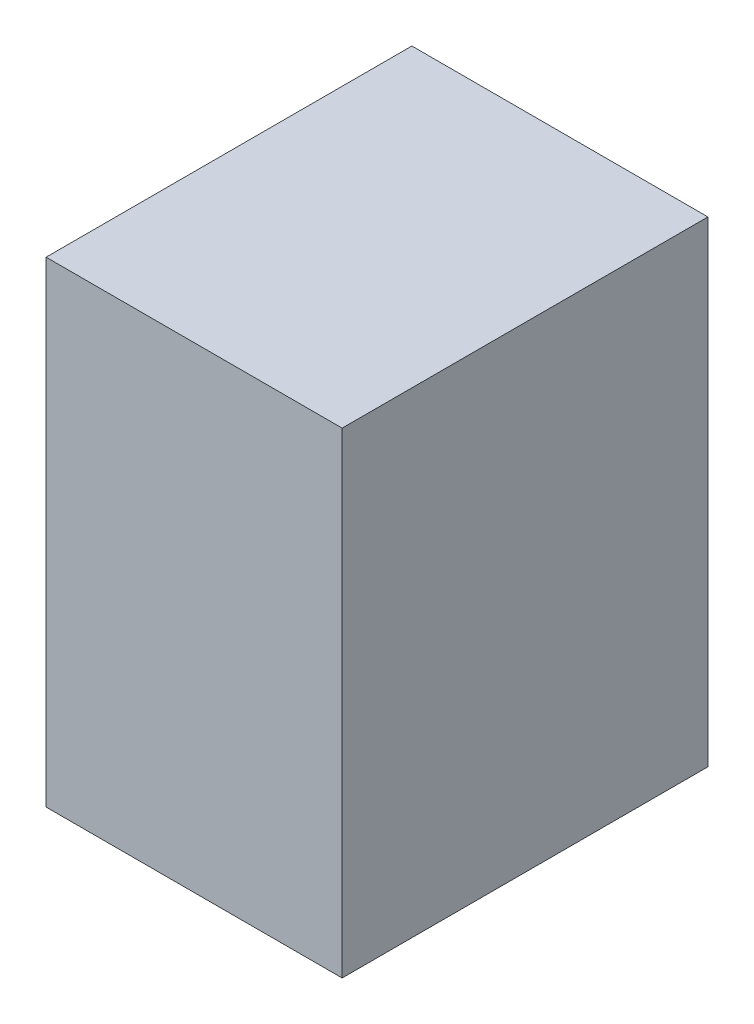
ISO-10303-21;
HEADER;
FILE_DESCRIPTION(('STEP AP214'),'2;1');
FILE_NAME('part.step','',(''),(''),'','','');
FILE_SCHEMA(('AUTOMOTIVE_DESIGN { 1 0 10303 214 1 1 1 1 }'));
ENDSEC;
DATA;
#1=APPLICATION_CONTEXT('core data for automotive mechanical design processes');
#2=APPLICATION_PROTOCOL_DEFINITION('international standard','automotive_design',2000,#1);
#3=PRODUCT_CONTEXT('',#1,'mechanical');
#4=PRODUCT('Part','Part','',(#3));
#5=PRODUCT_RELATED_PRODUCT_CATEGORY('part','',(#4));
#6=PRODUCT_DEFINITION_FORMATION('','',#4);
#7=PRODUCT_DEFINITION_CONTEXT('part definition',#1,'design');
#8=PRODUCT_DEFINITION('design','',#6,#7);
#9=PRODUCT_DEFINITION_SHAPE('','',#8);
#10=(LENGTH_UNIT() NAMED_UNIT(*) SI_UNIT(.MILLI.,.METRE.));
#11=(NAMED_UNIT(*) PLANE_ANGLE_UNIT() SI_UNIT($,.RADIAN.));
#12=(NAMED_UNIT(*) SI_UNIT($,.STERADIAN.) SOLID_ANGLE_UNIT());
#13=UNCERTAINTY_MEASURE_WITH_UNIT(LENGTH_MEASURE(1.E-05),#10,'distance_accuracy_value','');
#14=(GEOMETRIC_REPRESENTATION_CONTEXT(3) GLOBAL_UNCERTAINTY_ASSIGNED_CONTEXT((#13)) GLOBAL_UNIT_ASSIGNED_CONTEXT((#10,
#11,#12)) REPRESENTATION_CONTEXT('',''));
#15=CARTESIAN_POINT('',(0.,0.,0.));
#16=DIRECTION('',(0.,0.,1.));
#17=DIRECTION('',(1.,0.,0.));
#18=AXIS2_PLACEMENT_3D('',#15,#16,#17);
#19=CARTESIAN_POINT('',(0.5463413,-0.87882476,0.));
#20=DIRECTION('',(-1.,0.,0.));
#21=DIRECTION('',(0.,0.,1.));
#22=AXIS2_PLACEMENT_3D('',#19,#20,#21);
#23=PLANE('',#22);
#24=DIRECTION('',(0.,0.,-1.));
#25=VECTOR('',#24,1.);
#26=CARTESIAN_POINT('',(0.5463413,0.87882476,0.));
#27=LINE('',#26,#25);
#28=CARTESIAN_POINT('',(0.5463413,0.87882476,0.));
#29=VERTEX_POINT('',#28);
#30=CARTESIAN_POINT('',(0.5463413,0.87882476,1.34999984));
#31=VERTEX_POINT('',#30);
#32=EDGE_CURVE('E20',#29,#31,#27,.F.);
#33=ORIENTED_EDGE('',*,*,#32,.T.);
#34=DIRECTION('',(0.,1.,0.));
#35=VECTOR('',#34,1.);
#36=CARTESIAN_POINT('',(0.5463413,0.87882476,1.34999984));
#37=LINE('',#36,#35);
#38=CARTESIAN_POINT('',(0.5463413,-0.87882476,1.34999984));
#39=VERTEX_POINT('',#38);
#40=EDGE_CURVE('E55',#31,#39,#37,.F.);
#41=ORIENTED_EDGE('',*,*,#40,.T.);
#42=DIRECTION('',(0.,0.,1.));
#43=VECTOR('',#42,1.);
#44=CARTESIAN_POINT('',(0.5463413,-0.87882476,0.));
#45=LINE('',#44,#43);
#46=CARTESIAN_POINT('',(0.5463413,-0.87882476,0.));
#47=VERTEX_POINT('',#46);
#48=EDGE_CURVE('E74',#39,#47,#45,.F.);
#49=ORIENTED_EDGE('',*,*,#48,.T.);
#50=DIRECTION('',(0.,1.,0.));
#51=VECTOR('',#50,1.);
#52=CARTESIAN_POINT('',(0.5463413,0.87882476,0.));
#53=LINE('',#52,#51);
#54=EDGE_CURVE('E66',#29,#47,#53,.F.);
#55=ORIENTED_EDGE('',*,*,#54,.F.);
#56=EDGE_LOOP('',(#33,#41,#49,#55));
#57=FACE_BOUND('',#56,.T.);
#58=ADVANCED_FACE('F17',(#57),#23,.F.);
#59=CARTESIAN_POINT('',(0.5463413,0.87882476,0.));
#60=DIRECTION('',(0.,-1.,0.));
#61=DIRECTION('',(0.,0.,-1.));
#62=AXIS2_PLACEMENT_3D('',#59,#60,#61);
#63=PLANE('',#62);
#64=DIRECTION('',(0.,0.,-1.));
#65=VECTOR('',#64,1.);
#66=CARTESIAN_POINT('',(-0.5463413,0.87882476,0.));
#67=LINE('',#66,#65);
#68=CARTESIAN_POINT('',(-0.5463413,0.87882476,0.));
#69=VERTEX_POINT('',#68);
#70=CARTESIAN_POINT('',(-0.5463413,0.87882476,1.34999984));
#71=VERTEX_POINT('',#70);
#72=EDGE_CURVE('E72',#69,#71,#67,.F.);
#73=ORIENTED_EDGE('',*,*,#72,.T.);
#74=DIRECTION('',(-1.,0.,0.));
#75=VECTOR('',#74,1.);
#76=CARTESIAN_POINT('',(0.5463413,0.87882476,1.34999984));
#77=LINE('',#76,#75);
#78=EDGE_CURVE('E62',#71,#31,#77,.F.);
#79=ORIENTED_EDGE('',*,*,#78,.T.);
#80=ORIENTED_EDGE('',*,*,#32,.F.);
#81=DIRECTION('',(-1.,0.,0.));
#82=VECTOR('',#81,1.);
#83=CARTESIAN_POINT('',(0.5463413,0.87882476,0.));
#84=LINE('',#83,#82);
#85=EDGE_CURVE('E80',#69,#29,#84,.F.);
#86=ORIENTED_EDGE('',*,*,#85,.F.);
#87=EDGE_LOOP('',(#73,#79,#80,#86));
#88=FACE_BOUND('',#87,.T.);
#89=ADVANCED_FACE('F71',(#88),#63,.F.);
#90=CARTESIAN_POINT('',(0.5463413,0.87882476,1.34999984));
#91=DIRECTION('',(0.,0.,-1.));
#92=DIRECTION('',(-1.,0.,0.));
#93=AXIS2_PLACEMENT_3D('',#90,#91,#92);
#94=PLANE('',#93);
#95=DIRECTION('',(0.,1.,0.));
#96=VECTOR('',#95,1.);
#97=CARTESIAN_POINT('',(-0.5463413,0.87882476,1.34999984));
#98=LINE('',#97,#96);
#99=CARTESIAN_POINT('',(-0.5463413,-0.87882476,1.34999984));
#100=VERTEX_POINT('',#99);
#101=EDGE_CURVE('E83',#71,#100,#98,.F.);
#102=ORIENTED_EDGE('',*,*,#101,.T.);
#103=DIRECTION('',(1.,0.,0.));
#104=VECTOR('',#103,1.);
#105=CARTESIAN_POINT('',(-0.5463413,-0.87882476,1.34999984));
#106=LINE('',#105,#104);
#107=EDGE_CURVE('E64',#100,#39,#106,.T.);
#108=ORIENTED_EDGE('',*,*,#107,.T.);
#109=ORIENTED_EDGE('',*,*,#40,.F.);
#110=ORIENTED_EDGE('',*,*,#78,.F.);
#111=EDGE_LOOP('',(#102,#108,#109,#110));
#112=FACE_BOUND('',#111,.T.);
#113=ADVANCED_FACE('F60',(#112),#94,.F.);
#114=CARTESIAN_POINT('',(-0.5463413,-0.87882476,0.));
#115=DIRECTION('',(0.,1.,0.));
#116=DIRECTION('',(0.,0.,1.));
#117=AXIS2_PLACEMENT_3D('',#114,#115,#116);
#118=PLANE('',#117);
#119=ORIENTED_EDGE('',*,*,#48,.F.);
#120=ORIENTED_EDGE('',*,*,#107,.F.);
#121=DIRECTION('',(0.,0.,-1.));
#122=VECTOR('',#121,1.);
#123=CARTESIAN_POINT('',(-0.5463413,-0.87882476,0.));
#124=LINE('',#123,#122);
#125=CARTESIAN_POINT('',(-0.5463413,-0.87882476,0.));
#126=VERTEX_POINT('',#125);
#127=EDGE_CURVE('E26',#100,#126,#124,.T.);
#128=ORIENTED_EDGE('',*,*,#127,.T.);
#129=DIRECTION('',(-1.,0.,0.));
#130=VECTOR('',#129,1.);
#131=CARTESIAN_POINT('',(0.5463413,-0.87882476,0.));
#132=LINE('',#131,#130);
#133=EDGE_CURVE('E34',#47,#126,#132,.T.);
#134=ORIENTED_EDGE('',*,*,#133,.F.);
#135=EDGE_LOOP('',(#119,#120,#128,#134));
#136=FACE_BOUND('',#135,.T.);
#137=ADVANCED_FACE('F88',(#136),#118,.F.);
#138=CARTESIAN_POINT('',(0.5463413,0.87882476,0.));
#139=DIRECTION('',(0.,0.,-1.));
#140=DIRECTION('',(-1.,0.,0.));
#141=AXIS2_PLACEMENT_3D('',#138,#139,#140);
#142=PLANE('',#141);
#143=DIRECTION('',(0.,1.,0.));
#144=VECTOR('',#143,1.);
#145=CARTESIAN_POINT('',(-0.5463413,0.87882476,0.));
#146=LINE('',#145,#144);
#147=EDGE_CURVE('E11',#126,#69,#146,.T.);
#148=ORIENTED_EDGE('',*,*,#147,.T.);
#149=ORIENTED_EDGE('',*,*,#85,.T.);
#150=ORIENTED_EDGE('',*,*,#54,.T.);
#151=ORIENTED_EDGE('',*,*,#133,.T.);
#152=EDGE_LOOP('',(#148,#149,#150,#151));
#153=FACE_BOUND('',#152,.T.);
#154=ADVANCED_FACE('F91',(#153),#142,.T.);
#155=CARTESIAN_POINT('',(-0.5463413,0.87882476,0.));
#156=DIRECTION('',(1.,0.,0.));
#157=DIRECTION('',(0.,0.,-1.));
#158=AXIS2_PLACEMENT_3D('',#155,#156,#157);
#159=PLANE('',#158);
#160=ORIENTED_EDGE('',*,*,#127,.F.);
#161=ORIENTED_EDGE('',*,*,#101,.F.);
#162=ORIENTED_EDGE('',*,*,#72,.F.);
#163=ORIENTED_EDGE('',*,*,#147,.F.);
#164=EDGE_LOOP('',(#160,#161,#162,#163));
#165=FACE_BOUND('',#164,.T.);
#166=ADVANCED_FACE('F90',(#165),#159,.F.);
#167=CLOSED_SHELL('',(#58,#89,#113,#137,#154,#166));
#168=MANIFOLD_SOLID_BREP('B1',#167);
#169=ADVANCED_BREP_SHAPE_REPRESENTATION('',(#18,#168),#14);
#170=SHAPE_DEFINITION_REPRESENTATION(#9,#169);
ENDSEC;
END-ISO-10303-21;
